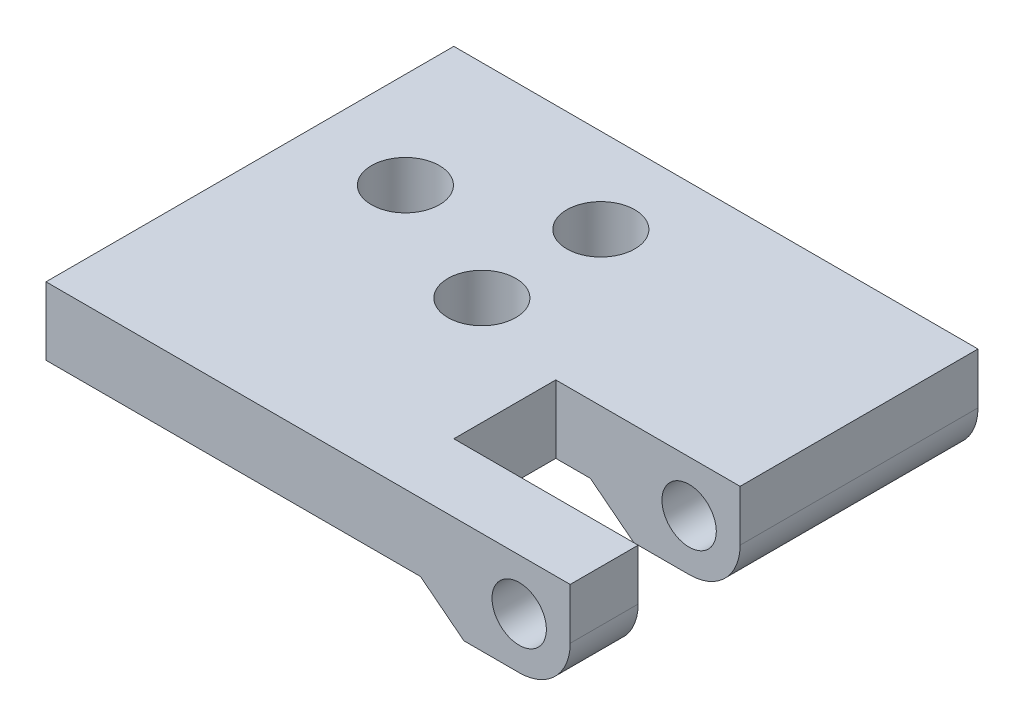
ISO-10303-21;
HEADER;
FILE_DESCRIPTION(('STEP AP214'),'2;1');
FILE_NAME('part.step','',(''),(''),'','','');
FILE_SCHEMA(('AUTOMOTIVE_DESIGN { 1 0 10303 214 1 1 1 1 }'));
ENDSEC;
DATA;
#1=APPLICATION_CONTEXT('core data for automotive mechanical design processes');
#2=APPLICATION_PROTOCOL_DEFINITION('international standard','automotive_design',2000,#1);
#3=PRODUCT_CONTEXT('',#1,'mechanical');
#4=PRODUCT('Part','Part','',(#3));
#5=PRODUCT_RELATED_PRODUCT_CATEGORY('part','',(#4));
#6=PRODUCT_DEFINITION_FORMATION('','',#4);
#7=PRODUCT_DEFINITION_CONTEXT('part definition',#1,'design');
#8=PRODUCT_DEFINITION('design','',#6,#7);
#9=PRODUCT_DEFINITION_SHAPE('','',#8);
#10=(LENGTH_UNIT() NAMED_UNIT(*) SI_UNIT(.MILLI.,.METRE.));
#11=(NAMED_UNIT(*) PLANE_ANGLE_UNIT() SI_UNIT($,.RADIAN.));
#12=(NAMED_UNIT(*) SI_UNIT($,.STERADIAN.) SOLID_ANGLE_UNIT());
#13=UNCERTAINTY_MEASURE_WITH_UNIT(LENGTH_MEASURE(1.E-05),#10,'distance_accuracy_value','');
#14=(GEOMETRIC_REPRESENTATION_CONTEXT(3) GLOBAL_UNCERTAINTY_ASSIGNED_CONTEXT((#13)) GLOBAL_UNIT_ASSIGNED_CONTEXT((#10,
#11,#12)) REPRESENTATION_CONTEXT('',''));
#15=CARTESIAN_POINT('',(0.,0.,0.));
#16=DIRECTION('',(0.,0.,1.));
#17=DIRECTION('',(1.,0.,0.));
#18=AXIS2_PLACEMENT_3D('',#15,#16,#17);
#19=CARTESIAN_POINT('',(2.15277777777778,3.,14.2992424242425));
#20=DIRECTION('',(0.,0.,-1.));
#21=DIRECTION('',(-1.,0.,0.));
#22=AXIS2_PLACEMENT_3D('',#19,#20,#21);
#23=CYLINDRICAL_SURFACE('',#22,3.);
#24=CARTESIAN_POINT('',(2.15277777777778,3.,10.2992424242425));
#25=DIRECTION('',(0.,0.,1.));
#26=DIRECTION('',(1.,0.,0.));
#27=AXIS2_PLACEMENT_3D('',#24,#25,#26);
#28=CIRCLE('',#27,3.);
#29=CARTESIAN_POINT('',(5.15277777777778,3.,10.2992424242425));
#30=VERTEX_POINT('',#29);
#31=CARTESIAN_POINT('',(2.15277777777778,0.,10.2992424242425));
#32=VERTEX_POINT('',#31);
#33=EDGE_CURVE('E194',#30,#32,#28,.F.);
#34=ORIENTED_EDGE('',*,*,#33,.F.);
#35=DIRECTION('',(0.,0.,-1.));
#36=VECTOR('',#35,1.);
#37=CARTESIAN_POINT('',(5.15277777777778,3.,14.2992424242425));
#38=LINE('',#37,#36);
#39=CARTESIAN_POINT('',(5.15277777777778,3.,14.2992424242425));
#40=VERTEX_POINT('',#39);
#41=EDGE_CURVE('E179',#40,#30,#38,.T.);
#42=ORIENTED_EDGE('',*,*,#41,.F.);
#43=CARTESIAN_POINT('',(2.15277777777778,3.,14.2992424242425));
#44=DIRECTION('',(0.,0.,1.));
#45=DIRECTION('',(1.,0.,0.));
#46=AXIS2_PLACEMENT_3D('',#43,#44,#45);
#47=CIRCLE('',#46,3.);
#48=CARTESIAN_POINT('',(2.15277777777778,0.,14.2992424242425));
#49=VERTEX_POINT('',#48);
#50=EDGE_CURVE('E181',#49,#40,#47,.T.);
#51=ORIENTED_EDGE('',*,*,#50,.F.);
#52=DIRECTION('',(0.,0.,-1.));
#53=VECTOR('',#52,1.);
#54=CARTESIAN_POINT('',(2.15277777777778,0.,14.2992424242425));
#55=LINE('',#54,#53);
#56=EDGE_CURVE('E189',#49,#32,#55,.T.);
#57=ORIENTED_EDGE('',*,*,#56,.T.);
#58=EDGE_LOOP('',(#34,#42,#51,#57));
#59=FACE_BOUND('',#58,.T.);
#60=ADVANCED_FACE('F41',(#59),#23,.T.);
#61=CARTESIAN_POINT('',(5.15277777777778,0.,14.2992424242425));
#62=DIRECTION('',(1.,0.,0.));
#63=DIRECTION('',(0.,1.,0.));
#64=AXIS2_PLACEMENT_3D('',#61,#62,#63);
#65=PLANE('',#64);
#66=DIRECTION('',(0.,-1.,0.));
#67=VECTOR('',#66,1.);
#68=CARTESIAN_POINT('',(5.15277777777778,0.,10.2992424242425));
#69=LINE('',#68,#67);
#70=CARTESIAN_POINT('',(5.15277777777778,6.,10.2992424242425));
#71=VERTEX_POINT('',#70);
#72=EDGE_CURVE('E11',#71,#30,#69,.T.);
#73=ORIENTED_EDGE('',*,*,#72,.F.);
#74=DIRECTION('',(0.,0.,-1.));
#75=VECTOR('',#74,1.);
#76=CARTESIAN_POINT('',(5.15277777777778,6.,14.2992424242425));
#77=LINE('',#76,#75);
#78=CARTESIAN_POINT('',(5.15277777777778,6.,14.2992424242425));
#79=VERTEX_POINT('',#78);
#80=EDGE_CURVE('E169',#79,#71,#77,.T.);
#81=ORIENTED_EDGE('',*,*,#80,.F.);
#82=DIRECTION('',(0.,-1.,0.));
#83=VECTOR('',#82,1.);
#84=CARTESIAN_POINT('',(5.15277777777778,0.,14.2992424242425));
#85=LINE('',#84,#83);
#86=EDGE_CURVE('E170',#79,#40,#85,.T.);
#87=ORIENTED_EDGE('',*,*,#86,.T.);
#88=ORIENTED_EDGE('',*,*,#41,.T.);
#89=EDGE_LOOP('',(#73,#81,#87,#88));
#90=FACE_BOUND('',#89,.T.);
#91=ADVANCED_FACE('F348',(#90),#65,.T.);
#92=CARTESIAN_POINT('',(0.,0.,0.));
#93=DIRECTION('',(0.,1.,0.));
#94=DIRECTION('',(0.,0.,1.));
#95=AXIS2_PLACEMENT_3D('',#92,#93,#94);
#96=PLANE('',#95);
#97=DIRECTION('',(-1.,0.,0.));
#98=VECTOR('',#97,1.);
#99=CARTESIAN_POINT('',(0.,0.,10.2992424242425));
#100=LINE('',#99,#98);
#101=CARTESIAN_POINT('',(-1.10011235807583,0.,10.2992424242425));
#102=VERTEX_POINT('',#101);
#103=EDGE_CURVE('E269',#32,#102,#100,.T.);
#104=ORIENTED_EDGE('',*,*,#103,.F.);
#105=ORIENTED_EDGE('',*,*,#56,.F.);
#106=DIRECTION('',(1.,0.,0.));
#107=VECTOR('',#106,1.);
#108=CARTESIAN_POINT('',(0.,0.,14.2992424242425));
#109=LINE('',#108,#107);
#110=CARTESIAN_POINT('',(-1.10011235807583,0.,14.2992424242425));
#111=VERTEX_POINT('',#110);
#112=EDGE_CURVE('E275',#111,#49,#109,.T.);
#113=ORIENTED_EDGE('',*,*,#112,.F.);
#114=DIRECTION('',(0.,0.,1.));
#115=VECTOR('',#114,1.);
#116=CARTESIAN_POINT('',(-1.10011235807583,0.,-12.7007575757576));
#117=LINE('',#116,#115);
#118=EDGE_CURVE('E202',#102,#111,#117,.T.);
#119=ORIENTED_EDGE('',*,*,#118,.F.);
#120=EDGE_LOOP('',(#104,#105,#113,#119));
#121=FACE_BOUND('',#120,.T.);
#122=ADVANCED_FACE('F383',(#121),#96,.F.);
#123=CARTESIAN_POINT('',(0.,6.,10.2992424242425));
#124=DIRECTION('',(0.,0.,1.));
#125=DIRECTION('',(1.,0.,0.));
#126=AXIS2_PLACEMENT_3D('',#123,#124,#125);
#127=PLANE('',#126);
#128=CARTESIAN_POINT('',(2.15277777777778,3.,10.2992424242425));
#129=DIRECTION('',(0.,0.,1.));
#130=DIRECTION('',(1.,0.,0.));
#131=AXIS2_PLACEMENT_3D('',#128,#129,#130);
#132=CIRCLE('',#131,1.6);
#133=CARTESIAN_POINT('',(3.75277777777778,3.,10.2992424242425));
#134=VERTEX_POINT('',#133);
#135=EDGE_CURVE('E265',#134,#134,#132,.T.);
#136=ORIENTED_EDGE('',*,*,#135,.T.);
#137=EDGE_LOOP('',(#136));
#138=FACE_BOUND('',#137,.T.);
#139=DIRECTION('',(-1.,0.,0.));
#140=VECTOR('',#139,1.);
#141=CARTESIAN_POINT('',(0.,6.,10.2992424242425));
#142=LINE('',#141,#140);
#143=CARTESIAN_POINT('',(-5.69444444444444,6.,10.2992424242425));
#144=VERTEX_POINT('',#143);
#145=EDGE_CURVE('E64',#71,#144,#142,.T.);
#146=ORIENTED_EDGE('',*,*,#145,.F.);
#147=ORIENTED_EDGE('',*,*,#72,.T.);
#148=ORIENTED_EDGE('',*,*,#33,.T.);
#149=ORIENTED_EDGE('',*,*,#103,.T.);
#150=DIRECTION('',(0.787792651553475,-0.615940531348884,0.));
#151=VECTOR('',#150,1.);
#152=CARTESIAN_POINT('',(-3.3287641850322,1.74248514222652,10.2992424242425));
#153=LINE('',#152,#151);
#154=CARTESIAN_POINT('',(-3.65812765811865,2.,10.2992424242425));
#155=VERTEX_POINT('',#154);
#156=EDGE_CURVE('E214',#155,#102,#153,.T.);
#157=ORIENTED_EDGE('',*,*,#156,.F.);
#158=DIRECTION('',(1.,0.,0.));
#159=VECTOR('',#158,1.);
#160=CARTESIAN_POINT('',(0.,2.,10.2992424242425));
#161=LINE('',#160,#159);
#162=CARTESIAN_POINT('',(-5.69444444444444,2.,10.2992424242425));
#163=VERTEX_POINT('',#162);
#164=EDGE_CURVE('E249',#163,#155,#161,.T.);
#165=ORIENTED_EDGE('',*,*,#164,.F.);
#166=DIRECTION('',(0.,-1.,0.));
#167=VECTOR('',#166,1.);
#168=CARTESIAN_POINT('',(-5.69444444444444,6.,10.2992424242425));
#169=LINE('',#168,#167);
#170=EDGE_CURVE('E163',#144,#163,#169,.T.);
#171=ORIENTED_EDGE('',*,*,#170,.F.);
#172=EDGE_LOOP('',(#146,#147,#148,#149,#157,#165,#171));
#173=FACE_BOUND('',#172,.T.);
#174=ADVANCED_FACE('F341',(#138,#173),#127,.F.);
#175=CARTESIAN_POINT('',(0.,6.,4.29924242424245));
#176=DIRECTION('',(0.,0.,1.));
#177=DIRECTION('',(1.,0.,0.));
#178=AXIS2_PLACEMENT_3D('',#175,#176,#177);
#179=PLANE('',#178);
#180=CARTESIAN_POINT('',(2.15277777777778,3.,4.29924242424245));
#181=DIRECTION('',(0.,0.,1.));
#182=DIRECTION('',(1.,0.,0.));
#183=AXIS2_PLACEMENT_3D('',#180,#181,#182);
#184=CIRCLE('',#183,3.);
#185=CARTESIAN_POINT('',(5.15277777777778,3.,4.29924242424245));
#186=VERTEX_POINT('',#185);
#187=CARTESIAN_POINT('',(2.15277777777778,0.,4.29924242424245));
#188=VERTEX_POINT('',#187);
#189=EDGE_CURVE('E57',#186,#188,#184,.F.);
#190=ORIENTED_EDGE('',*,*,#189,.F.);
#191=DIRECTION('',(0.,1.,0.));
#192=VECTOR('',#191,1.);
#193=CARTESIAN_POINT('',(5.15277777777778,0.,4.29924242424245));
#194=LINE('',#193,#192);
#195=CARTESIAN_POINT('',(5.15277777777779,6.,4.29924242424245));
#196=VERTEX_POINT('',#195);
#197=EDGE_CURVE('E50',#186,#196,#194,.T.);
#198=ORIENTED_EDGE('',*,*,#197,.T.);
#199=DIRECTION('',(-1.,0.,0.));
#200=VECTOR('',#199,1.);
#201=CARTESIAN_POINT('',(0.,6.,4.29924242424245));
#202=LINE('',#201,#200);
#203=CARTESIAN_POINT('',(-5.69444444444444,6.,4.29924242424245));
#204=VERTEX_POINT('',#203);
#205=EDGE_CURVE('E144',#196,#204,#202,.T.);
#206=ORIENTED_EDGE('',*,*,#205,.T.);
#207=DIRECTION('',(0.,-1.,0.));
#208=VECTOR('',#207,1.);
#209=CARTESIAN_POINT('',(-5.69444444444444,6.,4.29924242424245));
#210=LINE('',#209,#208);
#211=CARTESIAN_POINT('',(-5.69444444444444,2.,4.29924242424245));
#212=VERTEX_POINT('',#211);
#213=EDGE_CURVE('E315',#204,#212,#210,.T.);
#214=ORIENTED_EDGE('',*,*,#213,.T.);
#215=DIRECTION('',(1.,0.,0.));
#216=VECTOR('',#215,1.);
#217=CARTESIAN_POINT('',(0.,2.,4.29924242424245));
#218=LINE('',#217,#216);
#219=CARTESIAN_POINT('',(-3.65812765811865,2.,4.29924242424245));
#220=VERTEX_POINT('',#219);
#221=EDGE_CURVE('E242',#212,#220,#218,.T.);
#222=ORIENTED_EDGE('',*,*,#221,.T.);
#223=DIRECTION('',(0.787792651553475,-0.615940531348884,0.));
#224=VECTOR('',#223,1.);
#225=CARTESIAN_POINT('',(-3.3287641850322,1.74248514222653,4.29924242424245));
#226=LINE('',#225,#224);
#227=CARTESIAN_POINT('',(-1.10011235807583,0.,4.29924242424245));
#228=VERTEX_POINT('',#227);
#229=EDGE_CURVE('E210',#220,#228,#226,.T.);
#230=ORIENTED_EDGE('',*,*,#229,.T.);
#231=DIRECTION('',(-1.,0.,0.));
#232=VECTOR('',#231,1.);
#233=CARTESIAN_POINT('',(0.,0.,4.29924242424245));
#234=LINE('',#233,#232);
#235=EDGE_CURVE('E298',#188,#228,#234,.T.);
#236=ORIENTED_EDGE('',*,*,#235,.F.);
#237=EDGE_LOOP('',(#190,#198,#206,#214,#222,#230,#236));
#238=FACE_BOUND('',#237,.T.);
#239=CARTESIAN_POINT('',(2.15277777777778,3.,4.29924242424245));
#240=DIRECTION('',(0.,0.,1.));
#241=DIRECTION('',(1.,0.,0.));
#242=AXIS2_PLACEMENT_3D('',#239,#240,#241);
#243=CIRCLE('',#242,1.6);
#244=CARTESIAN_POINT('',(3.75277777777778,3.,4.29924242424245));
#245=VERTEX_POINT('',#244);
#246=EDGE_CURVE('E261',#245,#245,#243,.T.);
#247=ORIENTED_EDGE('',*,*,#246,.F.);
#248=EDGE_LOOP('',(#247));
#249=FACE_BOUND('',#248,.T.);
#250=ADVANCED_FACE('F158',(#238,#249),#179,.T.);
#251=CARTESIAN_POINT('',(0.,6.,-9.70075757575754));
#252=DIRECTION('',(0.,0.,-1.));
#253=DIRECTION('',(-1.,0.,0.));
#254=AXIS2_PLACEMENT_3D('',#251,#252,#253);
#255=PLANE('',#254);
#256=CARTESIAN_POINT('',(2.15277777777778,3.,-9.70075757575754));
#257=DIRECTION('',(0.,0.,1.));
#258=DIRECTION('',(1.,0.,0.));
#259=AXIS2_PLACEMENT_3D('',#256,#257,#258);
#260=CIRCLE('',#259,3.);
#261=CARTESIAN_POINT('',(2.15277777777778,0.,-9.70075757575754));
#262=VERTEX_POINT('',#261);
#263=CARTESIAN_POINT('',(5.15277777777778,3.,-9.70075757575754));
#264=VERTEX_POINT('',#263);
#265=EDGE_CURVE('E185',#262,#264,#260,.T.);
#266=ORIENTED_EDGE('',*,*,#265,.F.);
#267=DIRECTION('',(1.,0.,0.));
#268=VECTOR('',#267,1.);
#269=CARTESIAN_POINT('',(0.,0.,-9.70075757575754));
#270=LINE('',#269,#268);
#271=CARTESIAN_POINT('',(-1.10011235807583,0.,-9.70075757575754));
#272=VERTEX_POINT('',#271);
#273=EDGE_CURVE('E301',#272,#262,#270,.T.);
#274=ORIENTED_EDGE('',*,*,#273,.F.);
#275=DIRECTION('',(-0.787792651553475,0.615940531348884,0.));
#276=VECTOR('',#275,1.);
#277=CARTESIAN_POINT('',(-3.32876418503221,1.74248514222653,-9.70075757575754));
#278=LINE('',#277,#276);
#279=CARTESIAN_POINT('',(-3.65812765811865,2.,-9.70075757575754));
#280=VERTEX_POINT('',#279);
#281=EDGE_CURVE('E206',#272,#280,#278,.T.);
#282=ORIENTED_EDGE('',*,*,#281,.T.);
#283=DIRECTION('',(1.,0.,0.));
#284=VECTOR('',#283,1.);
#285=CARTESIAN_POINT('',(-25.6944444444444,2.,-9.70075757575754));
#286=LINE('',#285,#284);
#287=CARTESIAN_POINT('',(-25.6944444444444,2.,-9.70075757575754));
#288=VERTEX_POINT('',#287);
#289=EDGE_CURVE('E221',#288,#280,#286,.T.);
#290=ORIENTED_EDGE('',*,*,#289,.F.);
#291=DIRECTION('',(0.,-1.,0.));
#292=VECTOR('',#291,1.);
#293=CARTESIAN_POINT('',(-25.6944444444444,6.,-9.70075757575754));
#294=LINE('',#293,#292);
#295=CARTESIAN_POINT('',(-25.6944444444444,6.,-9.70075757575754));
#296=VERTEX_POINT('',#295);
#297=EDGE_CURVE('E311',#296,#288,#294,.T.);
#298=ORIENTED_EDGE('',*,*,#297,.F.);
#299=DIRECTION('',(1.,0.,0.));
#300=VECTOR('',#299,1.);
#301=CARTESIAN_POINT('',(0.,6.,-9.70075757575754));
#302=LINE('',#301,#300);
#303=CARTESIAN_POINT('',(5.15277777777778,6.,-9.70075757575754));
#304=VERTEX_POINT('',#303);
#305=EDGE_CURVE('E156',#296,#304,#302,.T.);
#306=ORIENTED_EDGE('',*,*,#305,.T.);
#307=DIRECTION('',(0.,-1.,0.));
#308=VECTOR('',#307,1.);
#309=CARTESIAN_POINT('',(5.15277777777778,0.,-9.70075757575754));
#310=LINE('',#309,#308);
#311=EDGE_CURVE('E167',#304,#264,#310,.T.);
#312=ORIENTED_EDGE('',*,*,#311,.T.);
#313=EDGE_LOOP('',(#266,#274,#282,#290,#298,#306,#312));
#314=FACE_BOUND('',#313,.T.);
#315=CARTESIAN_POINT('',(2.15277777777778,3.,-9.70075757575754));
#316=DIRECTION('',(0.,0.,-1.));
#317=DIRECTION('',(-1.,0.,0.));
#318=AXIS2_PLACEMENT_3D('',#315,#316,#317);
#319=CIRCLE('',#318,1.6);
#320=CARTESIAN_POINT('',(0.552777777777779,3.,-9.70075757575754));
#321=VERTEX_POINT('',#320);
#322=EDGE_CURVE('E257',#321,#321,#319,.T.);
#323=ORIENTED_EDGE('',*,*,#322,.F.);
#324=EDGE_LOOP('',(#323));
#325=FACE_BOUND('',#324,.T.);
#326=ADVANCED_FACE('F364',(#314,#325),#255,.T.);
#327=CARTESIAN_POINT('',(0.,6.,14.2992424242425));
#328=DIRECTION('',(0.,0.,-1.));
#329=DIRECTION('',(-1.,0.,0.));
#330=AXIS2_PLACEMENT_3D('',#327,#328,#329);
#331=PLANE('',#330);
#332=CARTESIAN_POINT('',(2.15277777777778,3.,14.2992424242425));
#333=DIRECTION('',(0.,0.,1.));
#334=DIRECTION('',(1.,0.,0.));
#335=AXIS2_PLACEMENT_3D('',#332,#333,#334);
#336=CIRCLE('',#335,1.6);
#337=CARTESIAN_POINT('',(3.75277777777778,3.,14.2992424242425));
#338=VERTEX_POINT('',#337);
#339=EDGE_CURVE('E253',#338,#338,#336,.T.);
#340=ORIENTED_EDGE('',*,*,#339,.F.);
#341=EDGE_LOOP('',(#340));
#342=FACE_BOUND('',#341,.T.);
#343=ORIENTED_EDGE('',*,*,#112,.T.);
#344=ORIENTED_EDGE('',*,*,#50,.T.);
#345=ORIENTED_EDGE('',*,*,#86,.F.);
#346=DIRECTION('',(1.,0.,0.));
#347=VECTOR('',#346,1.);
#348=CARTESIAN_POINT('',(0.,6.,14.2992424242425));
#349=LINE('',#348,#347);
#350=CARTESIAN_POINT('',(-25.6944444444444,6.,14.2992424242425));
#351=VERTEX_POINT('',#350);
#352=EDGE_CURVE('E292',#351,#79,#349,.T.);
#353=ORIENTED_EDGE('',*,*,#352,.F.);
#354=DIRECTION('',(0.,-1.,0.));
#355=VECTOR('',#354,1.);
#356=CARTESIAN_POINT('',(-25.6944444444444,6.,14.2992424242425));
#357=LINE('',#356,#355);
#358=CARTESIAN_POINT('',(-25.6944444444444,2.,14.2992424242425));
#359=VERTEX_POINT('',#358);
#360=EDGE_CURVE('E295',#351,#359,#357,.T.);
#361=ORIENTED_EDGE('',*,*,#360,.T.);
#362=DIRECTION('',(-1.,0.,0.));
#363=VECTOR('',#362,1.);
#364=CARTESIAN_POINT('',(-25.6944444444444,2.,14.2992424242425));
#365=LINE('',#364,#363);
#366=CARTESIAN_POINT('',(-3.65812765811865,2.,14.2992424242425));
#367=VERTEX_POINT('',#366);
#368=EDGE_CURVE('E230',#367,#359,#365,.T.);
#369=ORIENTED_EDGE('',*,*,#368,.F.);
#370=DIRECTION('',(0.787792651553475,-0.615940531348884,0.));
#371=VECTOR('',#370,1.);
#372=CARTESIAN_POINT('',(-0.417363638688644,-0.533811286723548,14.2992424242425));
#373=LINE('',#372,#371);
#374=EDGE_CURVE('E198',#367,#111,#373,.T.);
#375=ORIENTED_EDGE('',*,*,#374,.T.);
#376=EDGE_LOOP('',(#343,#344,#345,#353,#361,#369,#375));
#377=FACE_BOUND('',#376,.T.);
#378=ADVANCED_FACE('F351',(#342,#377),#331,.F.);
#379=ORIENTED_EDGE('',*,*,#273,.T.);
#380=EDGE_CURVE('E184',#188,#262,#55,.T.);
#381=ORIENTED_EDGE('',*,*,#380,.F.);
#382=ORIENTED_EDGE('',*,*,#235,.T.);
#383=EDGE_CURVE('E205',#272,#228,#117,.T.);
#384=ORIENTED_EDGE('',*,*,#383,.F.);
#385=EDGE_LOOP('',(#379,#381,#382,#384));
#386=FACE_BOUND('',#385,.T.);
#387=ADVANCED_FACE('F377',(#386),#96,.F.);
#388=CARTESIAN_POINT('',(-5.69444444444444,6.,0.));
#389=DIRECTION('',(-1.,0.,0.));
#390=DIRECTION('',(0.,0.,1.));
#391=AXIS2_PLACEMENT_3D('',#388,#389,#390);
#392=PLANE('',#391);
#393=DIRECTION('',(0.,0.,1.));
#394=VECTOR('',#393,1.);
#395=CARTESIAN_POINT('',(-5.69444444444444,2.,0.));
#396=LINE('',#395,#394);
#397=EDGE_CURVE('E246',#212,#163,#396,.T.);
#398=ORIENTED_EDGE('',*,*,#397,.F.);
#399=ORIENTED_EDGE('',*,*,#213,.F.);
#400=DIRECTION('',(0.,0.,-1.));
#401=VECTOR('',#400,1.);
#402=CARTESIAN_POINT('',(-5.69444444444444,6.,0.));
#403=LINE('',#402,#401);
#404=EDGE_CURVE('E152',#144,#204,#403,.T.);
#405=ORIENTED_EDGE('',*,*,#404,.F.);
#406=ORIENTED_EDGE('',*,*,#170,.T.);
#407=EDGE_LOOP('',(#398,#399,#405,#406));
#408=FACE_BOUND('',#407,.T.);
#409=ADVANCED_FACE('F343',(#408),#392,.F.);
#410=CARTESIAN_POINT('',(-25.6944444444444,6.,0.));
#411=DIRECTION('',(1.,0.,0.));
#412=DIRECTION('',(0.,0.,-1.));
#413=AXIS2_PLACEMENT_3D('',#410,#411,#412);
#414=PLANE('',#413);
#415=DIRECTION('',(0.,0.,-1.));
#416=VECTOR('',#415,1.);
#417=CARTESIAN_POINT('',(-25.6944444444444,2.,14.2992424242425));
#418=LINE('',#417,#416);
#419=EDGE_CURVE('E218',#359,#288,#418,.T.);
#420=ORIENTED_EDGE('',*,*,#419,.F.);
#421=ORIENTED_EDGE('',*,*,#360,.F.);
#422=DIRECTION('',(0.,0.,1.));
#423=VECTOR('',#422,1.);
#424=CARTESIAN_POINT('',(-25.6944444444444,6.,0.));
#425=LINE('',#424,#423);
#426=EDGE_CURVE('E289',#296,#351,#425,.T.);
#427=ORIENTED_EDGE('',*,*,#426,.F.);
#428=ORIENTED_EDGE('',*,*,#297,.T.);
#429=EDGE_LOOP('',(#420,#421,#427,#428));
#430=FACE_BOUND('',#429,.T.);
#431=ADVANCED_FACE('F372',(#430),#414,.F.);
#432=CARTESIAN_POINT('',(-20.0432574610932,6.,-1.20075757575754));
#433=DIRECTION('',(0.,-1.,0.));
#434=DIRECTION('',(0.,0.,-1.));
#435=AXIS2_PLACEMENT_3D('',#432,#433,#434);
#436=CYLINDRICAL_SURFACE('',#435,2.);
#437=CARTESIAN_POINT('',(-20.0432574610932,6.,-1.20075757575754));
#438=DIRECTION('',(0.,1.,0.));
#439=DIRECTION('',(0.,0.,1.));
#440=AXIS2_PLACEMENT_3D('',#437,#438,#439);
#441=CIRCLE('',#440,2.);
#442=CARTESIAN_POINT('',(-20.0432574610932,6.,0.799242424242459));
#443=VERTEX_POINT('',#442);
#444=EDGE_CURVE('E279',#443,#443,#441,.T.);
#445=ORIENTED_EDGE('',*,*,#444,.T.);
#446=EDGE_LOOP('',(#445));
#447=FACE_BOUND('',#446,.T.);
#448=CARTESIAN_POINT('',(-20.0432574610932,2.,-1.20075757575754));
#449=DIRECTION('',(0.,-1.,0.));
#450=DIRECTION('',(0.,0.,-1.));
#451=AXIS2_PLACEMENT_3D('',#448,#449,#450);
#452=CIRCLE('',#451,2.);
#453=CARTESIAN_POINT('',(-20.0432574610932,2.,-3.20075757575755));
#454=VERTEX_POINT('',#453);
#455=EDGE_CURVE('E238',#454,#454,#452,.T.);
#456=ORIENTED_EDGE('',*,*,#455,.T.);
#457=EDGE_LOOP('',(#456));
#458=FACE_BOUND('',#457,.T.);
#459=ADVANCED_FACE('F426',(#447,#458),#436,.F.);
#460=CARTESIAN_POINT('',(-12.0432574610932,6.,-4.70075757575754));
#461=DIRECTION('',(0.,-1.,0.));
#462=DIRECTION('',(0.,0.,-1.));
#463=AXIS2_PLACEMENT_3D('',#460,#461,#462);
#464=CYLINDRICAL_SURFACE('',#463,2.);
#465=CARTESIAN_POINT('',(-12.0432574610932,6.,-4.70075757575754));
#466=DIRECTION('',(0.,1.,0.));
#467=DIRECTION('',(0.,0.,1.));
#468=AXIS2_PLACEMENT_3D('',#465,#466,#467);
#469=CIRCLE('',#468,2.);
#470=CARTESIAN_POINT('',(-12.0432574610932,6.,-2.70075757575754));
#471=VERTEX_POINT('',#470);
#472=EDGE_CURVE('E274',#471,#471,#469,.T.);
#473=ORIENTED_EDGE('',*,*,#472,.T.);
#474=EDGE_LOOP('',(#473));
#475=FACE_BOUND('',#474,.T.);
#476=CARTESIAN_POINT('',(-12.0432574610932,2.,-4.70075757575754));
#477=DIRECTION('',(0.,-1.,0.));
#478=DIRECTION('',(0.,0.,-1.));
#479=AXIS2_PLACEMENT_3D('',#476,#477,#478);
#480=CIRCLE('',#479,2.);
#481=CARTESIAN_POINT('',(-12.0432574610932,2.,-6.70075757575754));
#482=VERTEX_POINT('',#481);
#483=EDGE_CURVE('E234',#482,#482,#480,.T.);
#484=ORIENTED_EDGE('',*,*,#483,.T.);
#485=EDGE_LOOP('',(#484));
#486=FACE_BOUND('',#485,.T.);
#487=ADVANCED_FACE('F421',(#475,#486),#464,.F.);
#488=CARTESIAN_POINT('',(-12.0432574610932,6.,2.29924242424246));
#489=DIRECTION('',(0.,-1.,0.));
#490=DIRECTION('',(0.,0.,-1.));
#491=AXIS2_PLACEMENT_3D('',#488,#489,#490);
#492=CYLINDRICAL_SURFACE('',#491,2.);
#493=CARTESIAN_POINT('',(-12.0432574610932,6.,2.29924242424246));
#494=DIRECTION('',(0.,1.,0.));
#495=DIRECTION('',(0.,0.,1.));
#496=AXIS2_PLACEMENT_3D('',#493,#494,#495);
#497=CIRCLE('',#496,2.);
#498=CARTESIAN_POINT('',(-12.0432574610932,6.,4.29924242424246));
#499=VERTEX_POINT('',#498);
#500=EDGE_CURVE('E270',#499,#499,#497,.T.);
#501=ORIENTED_EDGE('',*,*,#500,.T.);
#502=EDGE_LOOP('',(#501));
#503=FACE_BOUND('',#502,.T.);
#504=CARTESIAN_POINT('',(-12.0432574610932,2.,2.29924242424246));
#505=DIRECTION('',(0.,-1.,0.));
#506=DIRECTION('',(0.,0.,-1.));
#507=AXIS2_PLACEMENT_3D('',#504,#505,#506);
#508=CIRCLE('',#507,2.);
#509=CARTESIAN_POINT('',(-12.0432574610932,2.,0.299242424242456));
#510=VERTEX_POINT('',#509);
#511=EDGE_CURVE('E233',#510,#510,#508,.T.);
#512=ORIENTED_EDGE('',*,*,#511,.T.);
#513=EDGE_LOOP('',(#512));
#514=FACE_BOUND('',#513,.T.);
#515=ADVANCED_FACE('F43',(#503,#514),#492,.F.);
#516=CARTESIAN_POINT('',(0.,6.,0.));
#517=DIRECTION('',(0.,1.,0.));
#518=DIRECTION('',(0.,0.,1.));
#519=AXIS2_PLACEMENT_3D('',#516,#517,#518);
#520=PLANE('',#519);
#521=ORIENTED_EDGE('',*,*,#80,.T.);
#522=ORIENTED_EDGE('',*,*,#145,.T.);
#523=ORIENTED_EDGE('',*,*,#404,.T.);
#524=ORIENTED_EDGE('',*,*,#205,.F.);
#525=EDGE_CURVE('E150',#196,#304,#77,.T.);
#526=ORIENTED_EDGE('',*,*,#525,.T.);
#527=ORIENTED_EDGE('',*,*,#305,.F.);
#528=ORIENTED_EDGE('',*,*,#426,.T.);
#529=ORIENTED_EDGE('',*,*,#352,.T.);
#530=EDGE_LOOP('',(#521,#522,#523,#524,#526,#527,#528,#529));
#531=FACE_BOUND('',#530,.T.);
#532=ORIENTED_EDGE('',*,*,#500,.F.);
#533=EDGE_LOOP('',(#532));
#534=FACE_BOUND('',#533,.T.);
#535=ORIENTED_EDGE('',*,*,#472,.F.);
#536=EDGE_LOOP('',(#535));
#537=FACE_BOUND('',#536,.T.);
#538=ORIENTED_EDGE('',*,*,#444,.F.);
#539=EDGE_LOOP('',(#538));
#540=FACE_BOUND('',#539,.T.);
#541=ADVANCED_FACE('F146',(#531,#534,#537,#540),#520,.T.);
#542=CARTESIAN_POINT('',(2.15277777777778,3.,-11.7007575757576));
#543=DIRECTION('',(0.,0.,1.));
#544=DIRECTION('',(1.,0.,0.));
#545=AXIS2_PLACEMENT_3D('',#542,#543,#544);
#546=CYLINDRICAL_SURFACE('',#545,1.6);
#547=ORIENTED_EDGE('',*,*,#339,.T.);
#548=EDGE_LOOP('',(#547));
#549=FACE_BOUND('',#548,.T.);
#550=ORIENTED_EDGE('',*,*,#135,.F.);
#551=EDGE_LOOP('',(#550));
#552=FACE_BOUND('',#551,.T.);
#553=ADVANCED_FACE('F413',(#549,#552),#546,.F.);
#554=ORIENTED_EDGE('',*,*,#246,.T.);
#555=EDGE_LOOP('',(#554));
#556=FACE_BOUND('',#555,.T.);
#557=ORIENTED_EDGE('',*,*,#322,.T.);
#558=EDGE_LOOP('',(#557));
#559=FACE_BOUND('',#558,.T.);
#560=ADVANCED_FACE('F330',(#556,#559),#546,.F.);
#561=CARTESIAN_POINT('',(0.,2.,0.));
#562=DIRECTION('',(0.,-1.,0.));
#563=DIRECTION('',(0.,0.,-1.));
#564=AXIS2_PLACEMENT_3D('',#561,#562,#563);
#565=PLANE('',#564);
#566=ORIENTED_EDGE('',*,*,#511,.F.);
#567=EDGE_LOOP('',(#566));
#568=FACE_BOUND('',#567,.T.);
#569=ORIENTED_EDGE('',*,*,#483,.F.);
#570=EDGE_LOOP('',(#569));
#571=FACE_BOUND('',#570,.T.);
#572=ORIENTED_EDGE('',*,*,#455,.F.);
#573=EDGE_LOOP('',(#572));
#574=FACE_BOUND('',#573,.T.);
#575=ORIENTED_EDGE('',*,*,#164,.T.);
#576=DIRECTION('',(0.,0.,1.));
#577=VECTOR('',#576,1.);
#578=CARTESIAN_POINT('',(-3.65812765811865,2.,14.2992424242425));
#579=LINE('',#578,#577);
#580=EDGE_CURVE('E225',#155,#367,#579,.T.);
#581=ORIENTED_EDGE('',*,*,#580,.T.);
#582=ORIENTED_EDGE('',*,*,#368,.T.);
#583=ORIENTED_EDGE('',*,*,#419,.T.);
#584=ORIENTED_EDGE('',*,*,#289,.T.);
#585=EDGE_CURVE('E226',#280,#220,#579,.T.);
#586=ORIENTED_EDGE('',*,*,#585,.T.);
#587=ORIENTED_EDGE('',*,*,#221,.F.);
#588=ORIENTED_EDGE('',*,*,#397,.T.);
#589=EDGE_LOOP('',(#575,#581,#582,#583,#584,#586,#587,#588));
#590=FACE_BOUND('',#589,.T.);
#591=ADVANCED_FACE('F326',(#568,#571,#574,#590),#565,.T.);
#592=CARTESIAN_POINT('',(-0.417363638688644,-0.533811286723548,-12.7007575757576));
#593=DIRECTION('',(-0.615940531348884,-0.787792651553475,0.));
#594=DIRECTION('',(0.787792651553475,-0.615940531348884,0.));
#595=AXIS2_PLACEMENT_3D('',#592,#593,#594);
#596=PLANE('',#595);
#597=ORIENTED_EDGE('',*,*,#585,.F.);
#598=ORIENTED_EDGE('',*,*,#281,.F.);
#599=ORIENTED_EDGE('',*,*,#383,.T.);
#600=ORIENTED_EDGE('',*,*,#229,.F.);
#601=EDGE_LOOP('',(#597,#598,#599,#600));
#602=FACE_BOUND('',#601,.T.);
#603=ADVANCED_FACE('F329',(#602),#596,.T.);
#604=ORIENTED_EDGE('',*,*,#156,.T.);
#605=ORIENTED_EDGE('',*,*,#118,.T.);
#606=ORIENTED_EDGE('',*,*,#374,.F.);
#607=ORIENTED_EDGE('',*,*,#580,.F.);
#608=EDGE_LOOP('',(#604,#605,#606,#607));
#609=FACE_BOUND('',#608,.T.);
#610=ADVANCED_FACE('F402',(#609),#596,.T.);
#611=EDGE_CURVE('E174',#186,#264,#38,.T.);
#612=ORIENTED_EDGE('',*,*,#611,.F.);
#613=ORIENTED_EDGE('',*,*,#189,.T.);
#614=ORIENTED_EDGE('',*,*,#380,.T.);
#615=ORIENTED_EDGE('',*,*,#265,.T.);
#616=EDGE_LOOP('',(#612,#613,#614,#615));
#617=FACE_BOUND('',#616,.T.);
#618=ADVANCED_FACE('F360',(#617),#23,.T.);
#619=ORIENTED_EDGE('',*,*,#197,.F.);
#620=ORIENTED_EDGE('',*,*,#611,.T.);
#621=ORIENTED_EDGE('',*,*,#311,.F.);
#622=ORIENTED_EDGE('',*,*,#525,.F.);
#623=EDGE_LOOP('',(#619,#620,#621,#622));
#624=FACE_BOUND('',#623,.T.);
#625=ADVANCED_FACE('F165',(#624),#65,.T.);
#626=CLOSED_SHELL('',(#60,#91,#122,#174,#250,#326,#378,#387,#409,#431,#459,#487,#515,#541,#553,
#560,#591,#603,#610,#618,#625));
#627=MANIFOLD_SOLID_BREP('B2',#626);
#628=ADVANCED_BREP_SHAPE_REPRESENTATION('',(#18,#627),#14);
#629=SHAPE_DEFINITION_REPRESENTATION(#9,#628);
ENDSEC;
END-ISO-10303-21;
